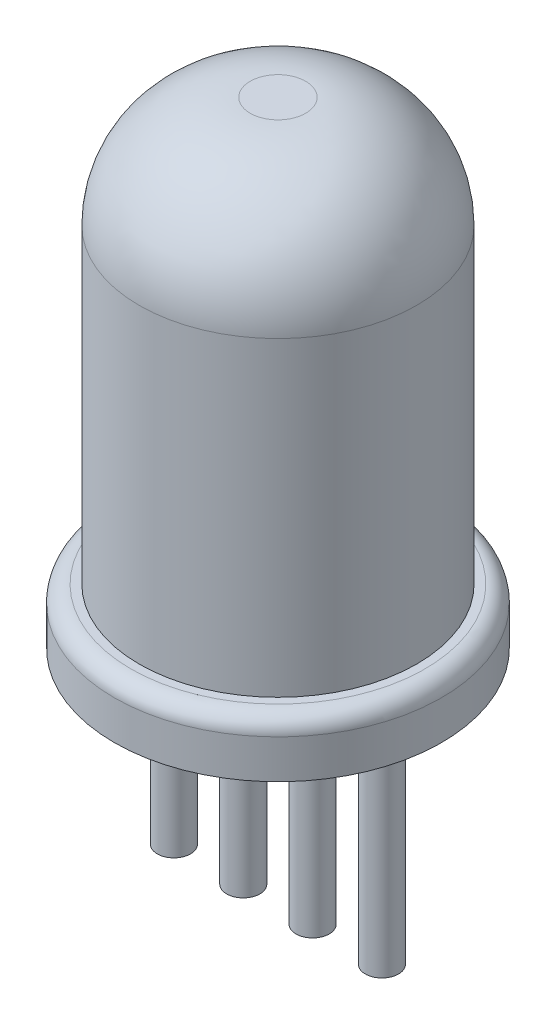
ISO-10303-21;
HEADER;
FILE_DESCRIPTION(('STEP AP214'),'2;1');
FILE_NAME('part.step','',(''),(''),'','','');
FILE_SCHEMA(('AUTOMOTIVE_DESIGN { 1 0 10303 214 1 1 1 1 }'));
ENDSEC;
DATA;
#1=APPLICATION_CONTEXT('core data for automotive mechanical design processes');
#2=APPLICATION_PROTOCOL_DEFINITION('international standard','automotive_design',2000,#1);
#3=PRODUCT_CONTEXT('',#1,'mechanical');
#4=PRODUCT('Part','Part','',(#3));
#5=PRODUCT_RELATED_PRODUCT_CATEGORY('part','',(#4));
#6=PRODUCT_DEFINITION_FORMATION('','',#4);
#7=PRODUCT_DEFINITION_CONTEXT('part definition',#1,'design');
#8=PRODUCT_DEFINITION('design','',#6,#7);
#9=PRODUCT_DEFINITION_SHAPE('','',#8);
#10=(LENGTH_UNIT() NAMED_UNIT(*) SI_UNIT(.MILLI.,.METRE.));
#11=(NAMED_UNIT(*) PLANE_ANGLE_UNIT() SI_UNIT($,.RADIAN.));
#12=(NAMED_UNIT(*) SI_UNIT($,.STERADIAN.) SOLID_ANGLE_UNIT());
#13=UNCERTAINTY_MEASURE_WITH_UNIT(LENGTH_MEASURE(1.E-05),#10,'distance_accuracy_value','');
#14=(GEOMETRIC_REPRESENTATION_CONTEXT(3) GLOBAL_UNCERTAINTY_ASSIGNED_CONTEXT((#13)) GLOBAL_UNIT_ASSIGNED_CONTEXT((#10,
#11,#12)) REPRESENTATION_CONTEXT('',''));
#15=CARTESIAN_POINT('',(0.,0.,0.));
#16=DIRECTION('',(0.,0.,1.));
#17=DIRECTION('',(1.,0.,0.));
#18=AXIS2_PLACEMENT_3D('',#15,#16,#17);
#19=CARTESIAN_POINT('',(1.875,4.,0.));
#20=DIRECTION('',(0.,-1.,0.));
#21=DIRECTION('',(1.,0.,0.));
#22=AXIS2_PLACEMENT_3D('',#19,#20,#21);
#23=PLANE('',#22);
#24=CARTESIAN_POINT('',(1.875,4.,0.));
#25=DIRECTION('',(0.,-1.,0.));
#26=DIRECTION('',(1.,0.,0.));
#27=AXIS2_PLACEMENT_3D('',#24,#25,#26);
#28=CIRCLE('',#27,0.3);
#29=CARTESIAN_POINT('',(2.175,4.,0.));
#30=VERTEX_POINT('',#29);
#31=EDGE_CURVE('E81',#30,#30,#28,.T.);
#32=ORIENTED_EDGE('',*,*,#31,.F.);
#33=EDGE_LOOP('',(#32));
#34=FACE_BOUND('',#33,.T.);
#35=ADVANCED_FACE('F74',(#34),#23,.F.);
#36=CARTESIAN_POINT('',(1.875,0.,0.));
#37=DIRECTION('',(0.,-1.,0.));
#38=DIRECTION('',(1.,0.,0.));
#39=AXIS2_PLACEMENT_3D('',#36,#37,#38);
#40=PLANE('',#39);
#41=CARTESIAN_POINT('',(1.875,0.,0.));
#42=DIRECTION('',(0.,-1.,0.));
#43=DIRECTION('',(1.,0.,0.));
#44=AXIS2_PLACEMENT_3D('',#41,#42,#43);
#45=CIRCLE('',#44,0.3);
#46=CARTESIAN_POINT('',(2.175,0.,0.));
#47=VERTEX_POINT('',#46);
#48=EDGE_CURVE('E13',#47,#47,#45,.T.);
#49=ORIENTED_EDGE('',*,*,#48,.T.);
#50=EDGE_LOOP('',(#49));
#51=FACE_BOUND('',#50,.T.);
#52=ADVANCED_FACE('F88',(#51),#40,.T.);
#53=CARTESIAN_POINT('',(1.875,4.,0.));
#54=DIRECTION('',(0.,-1.,0.));
#55=DIRECTION('',(1.,0.,0.));
#56=AXIS2_PLACEMENT_3D('',#53,#54,#55);
#57=CYLINDRICAL_SURFACE('',#56,0.3);
#58=ORIENTED_EDGE('',*,*,#48,.F.);
#59=EDGE_LOOP('',(#58));
#60=FACE_BOUND('',#59,.T.);
#61=ORIENTED_EDGE('',*,*,#31,.T.);
#62=EDGE_LOOP('',(#61));
#63=FACE_BOUND('',#62,.T.);
#64=ADVANCED_FACE('F90',(#60,#63),#57,.T.);
#65=CLOSED_SHELL('',(#35,#52,#64));
#66=MANIFOLD_SOLID_BREP('B2',#65);
#67=CARTESIAN_POINT('',(0.625,4.,0.));
#68=DIRECTION('',(0.,-1.,0.));
#69=DIRECTION('',(1.,0.,0.));
#70=AXIS2_PLACEMENT_3D('',#67,#68,#69);
#71=PLANE('',#70);
#72=CARTESIAN_POINT('',(0.625,4.,0.));
#73=DIRECTION('',(0.,-1.,0.));
#74=DIRECTION('',(1.,0.,0.));
#75=AXIS2_PLACEMENT_3D('',#72,#73,#74);
#76=CIRCLE('',#75,0.3);
#77=CARTESIAN_POINT('',(0.925,4.,0.));
#78=VERTEX_POINT('',#77);
#79=EDGE_CURVE('E134',#78,#78,#76,.T.);
#80=ORIENTED_EDGE('',*,*,#79,.F.);
#81=EDGE_LOOP('',(#80));
#82=FACE_BOUND('',#81,.T.);
#83=ADVANCED_FACE('F127',(#82),#71,.F.);
#84=CARTESIAN_POINT('',(0.625,0.,0.));
#85=DIRECTION('',(0.,-1.,0.));
#86=DIRECTION('',(1.,0.,0.));
#87=AXIS2_PLACEMENT_3D('',#84,#85,#86);
#88=PLANE('',#87);
#89=CARTESIAN_POINT('',(0.625,0.,0.));
#90=DIRECTION('',(0.,-1.,0.));
#91=DIRECTION('',(1.,0.,0.));
#92=AXIS2_PLACEMENT_3D('',#89,#90,#91);
#93=CIRCLE('',#92,0.3);
#94=CARTESIAN_POINT('',(0.925,0.,0.));
#95=VERTEX_POINT('',#94);
#96=EDGE_CURVE('E72',#95,#95,#93,.T.);
#97=ORIENTED_EDGE('',*,*,#96,.T.);
#98=EDGE_LOOP('',(#97));
#99=FACE_BOUND('',#98,.T.);
#100=ADVANCED_FACE('F141',(#99),#88,.T.);
#101=CARTESIAN_POINT('',(0.625,4.,0.));
#102=DIRECTION('',(0.,-1.,0.));
#103=DIRECTION('',(1.,0.,0.));
#104=AXIS2_PLACEMENT_3D('',#101,#102,#103);
#105=CYLINDRICAL_SURFACE('',#104,0.3);
#106=ORIENTED_EDGE('',*,*,#96,.F.);
#107=EDGE_LOOP('',(#106));
#108=FACE_BOUND('',#107,.T.);
#109=ORIENTED_EDGE('',*,*,#79,.T.);
#110=EDGE_LOOP('',(#109));
#111=FACE_BOUND('',#110,.T.);
#112=ADVANCED_FACE('F143',(#108,#111),#105,.T.);
#113=CLOSED_SHELL('',(#83,#100,#112));
#114=MANIFOLD_SOLID_BREP('B7',#113);
#115=CARTESIAN_POINT('',(-0.625,4.,0.));
#116=DIRECTION('',(0.,-1.,0.));
#117=DIRECTION('',(1.,0.,0.));
#118=AXIS2_PLACEMENT_3D('',#115,#116,#117);
#119=PLANE('',#118);
#120=CARTESIAN_POINT('',(-0.625,4.,0.));
#121=DIRECTION('',(0.,-1.,0.));
#122=DIRECTION('',(1.,0.,0.));
#123=AXIS2_PLACEMENT_3D('',#120,#121,#122);
#124=CIRCLE('',#123,0.3);
#125=CARTESIAN_POINT('',(-0.325,4.,0.));
#126=VERTEX_POINT('',#125);
#127=EDGE_CURVE('E187',#126,#126,#124,.T.);
#128=ORIENTED_EDGE('',*,*,#127,.F.);
#129=EDGE_LOOP('',(#128));
#130=FACE_BOUND('',#129,.T.);
#131=ADVANCED_FACE('F180',(#130),#119,.F.);
#132=CARTESIAN_POINT('',(-0.625,0.,0.));
#133=DIRECTION('',(0.,-1.,0.));
#134=DIRECTION('',(1.,0.,0.));
#135=AXIS2_PLACEMENT_3D('',#132,#133,#134);
#136=PLANE('',#135);
#137=CARTESIAN_POINT('',(-0.625,0.,0.));
#138=DIRECTION('',(0.,-1.,0.));
#139=DIRECTION('',(1.,0.,0.));
#140=AXIS2_PLACEMENT_3D('',#137,#138,#139);
#141=CIRCLE('',#140,0.3);
#142=CARTESIAN_POINT('',(-0.325,0.,0.));
#143=VERTEX_POINT('',#142);
#144=EDGE_CURVE('E125',#143,#143,#141,.T.);
#145=ORIENTED_EDGE('',*,*,#144,.T.);
#146=EDGE_LOOP('',(#145));
#147=FACE_BOUND('',#146,.T.);
#148=ADVANCED_FACE('F194',(#147),#136,.T.);
#149=CARTESIAN_POINT('',(-0.625,4.,0.));
#150=DIRECTION('',(0.,-1.,0.));
#151=DIRECTION('',(1.,0.,0.));
#152=AXIS2_PLACEMENT_3D('',#149,#150,#151);
#153=CYLINDRICAL_SURFACE('',#152,0.3);
#154=ORIENTED_EDGE('',*,*,#144,.F.);
#155=EDGE_LOOP('',(#154));
#156=FACE_BOUND('',#155,.T.);
#157=ORIENTED_EDGE('',*,*,#127,.T.);
#158=EDGE_LOOP('',(#157));
#159=FACE_BOUND('',#158,.T.);
#160=ADVANCED_FACE('F196',(#156,#159),#153,.T.);
#161=CLOSED_SHELL('',(#131,#148,#160));
#162=MANIFOLD_SOLID_BREP('B66',#161);
#163=CARTESIAN_POINT('',(-1.875,4.,0.));
#164=DIRECTION('',(0.,-1.,0.));
#165=DIRECTION('',(1.,0.,0.));
#166=AXIS2_PLACEMENT_3D('',#163,#164,#165);
#167=PLANE('',#166);
#168=CARTESIAN_POINT('',(-1.875,4.,0.));
#169=DIRECTION('',(0.,-1.,0.));
#170=DIRECTION('',(1.,0.,0.));
#171=AXIS2_PLACEMENT_3D('',#168,#169,#170);
#172=CIRCLE('',#171,0.3);
#173=CARTESIAN_POINT('',(-1.575,4.,0.));
#174=VERTEX_POINT('',#173);
#175=EDGE_CURVE('E237',#174,#174,#172,.T.);
#176=ORIENTED_EDGE('',*,*,#175,.F.);
#177=EDGE_LOOP('',(#176));
#178=FACE_BOUND('',#177,.T.);
#179=ADVANCED_FACE('F230',(#178),#167,.F.);
#180=CARTESIAN_POINT('',(-1.875,0.,0.));
#181=DIRECTION('',(0.,-1.,0.));
#182=DIRECTION('',(1.,0.,0.));
#183=AXIS2_PLACEMENT_3D('',#180,#181,#182);
#184=PLANE('',#183);
#185=CARTESIAN_POINT('',(-1.875,0.,0.));
#186=DIRECTION('',(0.,-1.,0.));
#187=DIRECTION('',(1.,0.,0.));
#188=AXIS2_PLACEMENT_3D('',#185,#186,#187);
#189=CIRCLE('',#188,0.3);
#190=CARTESIAN_POINT('',(-1.575,0.,0.));
#191=VERTEX_POINT('',#190);
#192=EDGE_CURVE('E178',#191,#191,#189,.T.);
#193=ORIENTED_EDGE('',*,*,#192,.T.);
#194=EDGE_LOOP('',(#193));
#195=FACE_BOUND('',#194,.T.);
#196=ADVANCED_FACE('F244',(#195),#184,.T.);
#197=CARTESIAN_POINT('',(-1.875,4.,0.));
#198=DIRECTION('',(0.,-1.,0.));
#199=DIRECTION('',(1.,0.,0.));
#200=AXIS2_PLACEMENT_3D('',#197,#198,#199);
#201=CYLINDRICAL_SURFACE('',#200,0.3);
#202=ORIENTED_EDGE('',*,*,#192,.F.);
#203=EDGE_LOOP('',(#202));
#204=FACE_BOUND('',#203,.T.);
#205=ORIENTED_EDGE('',*,*,#175,.T.);
#206=EDGE_LOOP('',(#205));
#207=FACE_BOUND('',#206,.T.);
#208=ADVANCED_FACE('F246',(#204,#207),#201,.T.);
#209=CLOSED_SHELL('',(#179,#196,#208));
#210=MANIFOLD_SOLID_BREP('B119',#209);
#211=CARTESIAN_POINT('',(0.,5.,0.));
#212=DIRECTION('',(0.,-1.,0.));
#213=DIRECTION('',(0.,0.,-1.));
#214=AXIS2_PLACEMENT_3D('',#211,#212,#213);
#215=CYLINDRICAL_SURFACE('',#214,2.95);
#216=CARTESIAN_POINT('',(0.,4.7,0.));
#217=DIRECTION('',(0.,1.,0.));
#218=DIRECTION('',(0.,0.,1.));
#219=AXIS2_PLACEMENT_3D('',#216,#217,#218);
#220=CIRCLE('',#219,2.95);
#221=CARTESIAN_POINT('',(0.,4.7,2.95));
#222=VERTEX_POINT('',#221);
#223=EDGE_CURVE('E229',#222,#222,#220,.F.);
#224=ORIENTED_EDGE('',*,*,#223,.T.);
#225=EDGE_LOOP('',(#224));
#226=FACE_BOUND('',#225,.T.);
#227=CARTESIAN_POINT('',(0.,4.,0.));
#228=DIRECTION('',(0.,1.,0.));
#229=DIRECTION('',(0.,0.,1.));
#230=AXIS2_PLACEMENT_3D('',#227,#228,#229);
#231=CIRCLE('',#230,2.95);
#232=CARTESIAN_POINT('',(0.,4.,2.95));
#233=VERTEX_POINT('',#232);
#234=EDGE_CURVE('E293',#233,#233,#231,.T.);
#235=ORIENTED_EDGE('',*,*,#234,.T.);
#236=EDGE_LOOP('',(#235));
#237=FACE_BOUND('',#236,.T.);
#238=ADVANCED_FACE('F273',(#226,#237),#215,.T.);
#239=CARTESIAN_POINT('',(0.,5.,0.));
#240=DIRECTION('',(0.,1.,0.));
#241=DIRECTION('',(0.,0.,1.));
#242=AXIS2_PLACEMENT_3D('',#239,#240,#241);
#243=PLANE('',#242);
#244=CARTESIAN_POINT('',(0.,5.,0.));
#245=DIRECTION('',(0.,1.,0.));
#246=DIRECTION('',(0.,0.,1.));
#247=AXIS2_PLACEMENT_3D('',#244,#245,#246);
#248=CIRCLE('',#247,2.65);
#249=CARTESIAN_POINT('',(0.,5.,2.65));
#250=VERTEX_POINT('',#249);
#251=EDGE_CURVE('E280',#250,#250,#248,.T.);
#252=ORIENTED_EDGE('',*,*,#251,.T.);
#253=EDGE_LOOP('',(#252));
#254=FACE_BOUND('',#253,.T.);
#255=CARTESIAN_POINT('',(0.,5.,0.));
#256=DIRECTION('',(0.,1.,0.));
#257=DIRECTION('',(0.,0.,1.));
#258=AXIS2_PLACEMENT_3D('',#255,#256,#257);
#259=CIRCLE('',#258,2.5);
#260=CARTESIAN_POINT('',(0.,5.,-2.5));
#261=VERTEX_POINT('',#260);
#262=EDGE_CURVE('E296',#261,#261,#259,.T.);
#263=ORIENTED_EDGE('',*,*,#262,.F.);
#264=EDGE_LOOP('',(#263));
#265=FACE_BOUND('',#264,.T.);
#266=ADVANCED_FACE('F302',(#254,#265),#243,.T.);
#267=CARTESIAN_POINT('',(0.,4.,0.));
#268=DIRECTION('',(0.,1.,0.));
#269=DIRECTION('',(0.,0.,1.));
#270=AXIS2_PLACEMENT_3D('',#267,#268,#269);
#271=PLANE('',#270);
#272=ORIENTED_EDGE('',*,*,#234,.F.);
#273=EDGE_LOOP('',(#272));
#274=FACE_BOUND('',#273,.T.);
#275=ADVANCED_FACE('F304',(#274),#271,.F.);
#276=CARTESIAN_POINT('',(0.,12.6,0.));
#277=DIRECTION('',(0.,-1.,0.));
#278=DIRECTION('',(0.,0.,-1.));
#279=AXIS2_PLACEMENT_3D('',#276,#277,#278);
#280=CYLINDRICAL_SURFACE('',#279,2.5);
#281=CARTESIAN_POINT('',(0.,10.6,0.));
#282=DIRECTION('',(0.,1.,0.));
#283=DIRECTION('',(0.,0.,1.));
#284=AXIS2_PLACEMENT_3D('',#281,#282,#283);
#285=CIRCLE('',#284,2.5);
#286=CARTESIAN_POINT('',(0.,10.6,-2.5));
#287=VERTEX_POINT('',#286);
#288=EDGE_CURVE('E284',#287,#287,#285,.F.);
#289=CARTESIAN_POINT('',(0.,10.6,-2.5));
#290=CARTESIAN_POINT('',(0.,10.5416666666667,-2.5));
#291=CARTESIAN_POINT('',(0.,10.4833333333333,-2.5));
#292=CARTESIAN_POINT('',(0.,10.3666666666667,-2.5));
#293=CARTESIAN_POINT('',(0.,10.3083333333333,-2.5));
#294=CARTESIAN_POINT('',(0.,10.1916666666667,-2.5));
#295=CARTESIAN_POINT('',(0.,10.1333333333333,-2.5));
#296=CARTESIAN_POINT('',(0.,10.0166666666667,-2.5));
#297=CARTESIAN_POINT('',(0.,9.95833333333333,-2.5));
#298=CARTESIAN_POINT('',(0.,9.84166666666666,-2.5));
#299=CARTESIAN_POINT('',(0.,9.78333333333333,-2.5));
#300=CARTESIAN_POINT('',(0.,9.66666666666666,-2.5));
#301=CARTESIAN_POINT('',(0.,9.60833333333333,-2.5));
#302=CARTESIAN_POINT('',(0.,9.49166666666666,-2.5));
#303=CARTESIAN_POINT('',(0.,9.43333333333333,-2.5));
#304=CARTESIAN_POINT('',(0.,9.31666666666666,-2.5));
#305=CARTESIAN_POINT('',(0.,9.25833333333333,-2.5));
#306=CARTESIAN_POINT('',(0.,9.14166666666666,-2.5));
#307=CARTESIAN_POINT('',(0.,9.08333333333333,-2.5));
#308=CARTESIAN_POINT('',(0.,8.96666666666666,-2.5));
#309=CARTESIAN_POINT('',(0.,8.90833333333333,-2.5));
#310=CARTESIAN_POINT('',(0.,8.79166666666666,-2.5));
#311=CARTESIAN_POINT('',(0.,8.73333333333333,-2.5));
#312=CARTESIAN_POINT('',(0.,8.61666666666666,-2.5));
#313=CARTESIAN_POINT('',(0.,8.55833333333333,-2.5));
#314=CARTESIAN_POINT('',(0.,8.44166666666666,-2.5));
#315=CARTESIAN_POINT('',(0.,8.38333333333333,-2.5));
#316=CARTESIAN_POINT('',(0.,8.26666666666666,-2.5));
#317=CARTESIAN_POINT('',(0.,8.20833333333333,-2.5));
#318=CARTESIAN_POINT('',(0.,8.09166666666666,-2.5));
#319=CARTESIAN_POINT('',(0.,8.03333333333333,-2.5));
#320=CARTESIAN_POINT('',(0.,7.91666666666666,-2.5));
#321=CARTESIAN_POINT('',(0.,7.85833333333333,-2.5));
#322=CARTESIAN_POINT('',(0.,7.74166666666666,-2.5));
#323=CARTESIAN_POINT('',(0.,7.68333333333333,-2.5));
#324=CARTESIAN_POINT('',(0.,7.56666666666666,-2.5));
#325=CARTESIAN_POINT('',(0.,7.50833333333333,-2.5));
#326=CARTESIAN_POINT('',(0.,7.39166666666666,-2.5));
#327=CARTESIAN_POINT('',(0.,7.33333333333333,-2.5));
#328=CARTESIAN_POINT('',(0.,7.21666666666667,-2.5));
#329=CARTESIAN_POINT('',(0.,7.15833333333333,-2.5));
#330=CARTESIAN_POINT('',(0.,7.04166666666667,-2.5));
#331=CARTESIAN_POINT('',(0.,6.98333333333333,-2.5));
#332=CARTESIAN_POINT('',(0.,6.86666666666667,-2.5));
#333=CARTESIAN_POINT('',(0.,6.80833333333333,-2.5));
#334=CARTESIAN_POINT('',(0.,6.69166666666667,-2.5));
#335=CARTESIAN_POINT('',(0.,6.63333333333333,-2.5));
#336=CARTESIAN_POINT('',(0.,6.51666666666667,-2.5));
#337=CARTESIAN_POINT('',(0.,6.45833333333333,-2.5));
#338=CARTESIAN_POINT('',(0.,6.34166666666667,-2.5));
#339=CARTESIAN_POINT('',(0.,6.28333333333333,-2.5));
#340=CARTESIAN_POINT('',(0.,6.16666666666667,-2.5));
#341=CARTESIAN_POINT('',(0.,6.10833333333333,-2.5));
#342=CARTESIAN_POINT('',(0.,5.99166666666667,-2.5));
#343=CARTESIAN_POINT('',(0.,5.93333333333333,-2.5));
#344=CARTESIAN_POINT('',(0.,5.81666666666667,-2.5));
#345=CARTESIAN_POINT('',(0.,5.75833333333333,-2.5));
#346=CARTESIAN_POINT('',(0.,5.64166666666667,-2.5));
#347=CARTESIAN_POINT('',(0.,5.58333333333333,-2.5));
#348=CARTESIAN_POINT('',(0.,5.46666666666667,-2.5));
#349=CARTESIAN_POINT('',(0.,5.40833333333333,-2.5));
#350=CARTESIAN_POINT('',(0.,5.29166666666667,-2.5));
#351=CARTESIAN_POINT('',(0.,5.23333333333333,-2.5));
#352=CARTESIAN_POINT('',(0.,5.11666666666667,-2.5));
#353=CARTESIAN_POINT('',(0.,5.05833333333333,-2.5));
#354=CARTESIAN_POINT('',(0.,5.,-2.5));
#355=B_SPLINE_CURVE_WITH_KNOTS('',3,(#289,#290,#291,#292,#293,#294,#295,#296,#297,#298,#299,
#300,#301,#302,#303,#304,#305,#306,#307,#308,#309,#310,#311,#312,#313,#314,#315,#316,#317,#318,
#319,#320,#321,#322,#323,#324,#325,#326,#327,#328,#329,#330,#331,#332,#333,#334,#335,#336,#337,
#338,#339,#340,#341,#342,#343,#344,#345,#346,#347,#348,#349,#350,#351,#352,#353,#354),
.UNSPECIFIED.,.F.,.F.,(4,2,2,2,2,2,2,2,2,2,2,2,2,2,2,2,2,2,2,2,2,2,2,2,2,2,2,2,2,2,2,2,4),(0.,
0.175,0.35,0.524999999999999,0.699999999999999,0.874999999999999,1.05,1.225,1.4,1.575,1.75,
1.925,2.1,2.275,2.45,2.625,2.8,2.975,3.15,3.325,3.5,3.67499999999999,3.84999999999999,4.025,
4.19999999999999,4.37499999999999,4.54999999999999,4.72499999999999,4.89999999999999,
5.07499999999999,5.24999999999999,5.42499999999999,5.59999999999999),.UNSPECIFIED.);
#356=EDGE_CURVE('BSEAM300',#287,#261,#355,.T.);
#357=ORIENTED_EDGE('',*,*,#288,.T.);
#358=ORIENTED_EDGE('',*,*,#262,.T.);
#359=ORIENTED_EDGE('',*,*,#356,.T.);
#360=ORIENTED_EDGE('',*,*,#356,.F.);
#361=EDGE_LOOP('',(#357,#359,#358,#360));
#362=FACE_BOUND('',#361,.T.);
#363=ADVANCED_FACE('F300',(#362),#280,.T.);
#364=CARTESIAN_POINT('',(0.,12.6,0.));
#365=DIRECTION('',(0.,1.,0.));
#366=DIRECTION('',(0.,0.,1.));
#367=AXIS2_PLACEMENT_3D('',#364,#365,#366);
#368=PLANE('',#367);
#369=CARTESIAN_POINT('',(0.,12.6,0.));
#370=DIRECTION('',(0.,1.,0.));
#371=DIRECTION('',(0.,0.,1.));
#372=AXIS2_PLACEMENT_3D('',#369,#370,#371);
#373=CIRCLE('',#372,0.5);
#374=CARTESIAN_POINT('',(0.,12.6,0.5));
#375=VERTEX_POINT('',#374);
#376=EDGE_CURVE('E288',#375,#375,#373,.T.);
#377=ORIENTED_EDGE('',*,*,#376,.T.);
#378=EDGE_LOOP('',(#377));
#379=FACE_BOUND('',#378,.T.);
#380=ADVANCED_FACE('F317',(#379),#368,.T.);
#381=CARTESIAN_POINT('',(0.,10.6,0.));
#382=DIRECTION('',(0.,1.,0.));
#383=DIRECTION('',(0.,0.,1.));
#384=AXIS2_PLACEMENT_3D('',#381,#382,#383);
#385=DEGENERATE_TOROIDAL_SURFACE('',#384,0.5,2.,.T.);
#386=ORIENTED_EDGE('',*,*,#288,.F.);
#387=EDGE_LOOP('',(#386));
#388=FACE_BOUND('',#387,.T.);
#389=ORIENTED_EDGE('',*,*,#376,.F.);
#390=EDGE_LOOP('',(#389));
#391=FACE_BOUND('',#390,.T.);
#392=ADVANCED_FACE('F315',(#388,#391),#385,.T.);
#393=CARTESIAN_POINT('',(0.,4.7,0.));
#394=DIRECTION('',(0.,1.,0.));
#395=DIRECTION('',(0.,0.,1.));
#396=AXIS2_PLACEMENT_3D('',#393,#394,#395);
#397=TOROIDAL_SURFACE('',#396,2.65,0.3);
#398=ORIENTED_EDGE('',*,*,#223,.F.);
#399=EDGE_LOOP('',(#398));
#400=FACE_BOUND('',#399,.T.);
#401=ORIENTED_EDGE('',*,*,#251,.F.);
#402=EDGE_LOOP('',(#401));
#403=FACE_BOUND('',#402,.T.);
#404=ADVANCED_FACE('F275',(#400,#403),#397,.T.);
#405=CLOSED_SHELL('',(#238,#266,#275,#363,#380,#392,#404));
#406=MANIFOLD_SOLID_BREP('B172',#405);
#407=ADVANCED_BREP_SHAPE_REPRESENTATION('',(#18,#66,#114,#162,#210,#406),#14);
#408=SHAPE_DEFINITION_REPRESENTATION(#9,#407);
ENDSEC;
END-ISO-10303-21;
